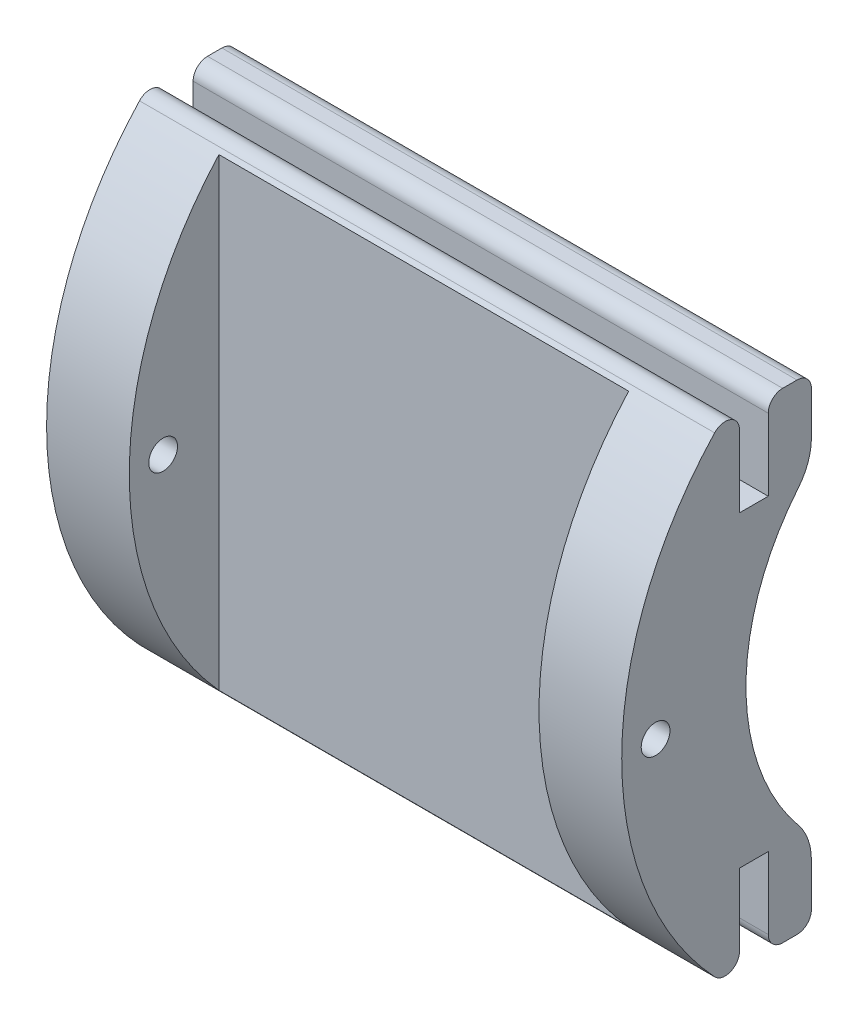
ISO-10303-21;
HEADER;
FILE_DESCRIPTION(('STEP AP214'),'2;1');
FILE_NAME('part.step','',(''),(''),'','','');
FILE_SCHEMA(('AUTOMOTIVE_DESIGN { 1 0 10303 214 1 1 1 1 }'));
ENDSEC;
DATA;
#1=APPLICATION_CONTEXT('core data for automotive mechanical design processes');
#2=APPLICATION_PROTOCOL_DEFINITION('international standard','automotive_design',2000,#1);
#3=PRODUCT_CONTEXT('',#1,'mechanical');
#4=PRODUCT('Part','Part','',(#3));
#5=PRODUCT_RELATED_PRODUCT_CATEGORY('part','',(#4));
#6=PRODUCT_DEFINITION_FORMATION('','',#4);
#7=PRODUCT_DEFINITION_CONTEXT('part definition',#1,'design');
#8=PRODUCT_DEFINITION('design','',#6,#7);
#9=PRODUCT_DEFINITION_SHAPE('','',#8);
#10=(LENGTH_UNIT() NAMED_UNIT(*) SI_UNIT(.MILLI.,.METRE.));
#11=(NAMED_UNIT(*) PLANE_ANGLE_UNIT() SI_UNIT($,.RADIAN.));
#12=(NAMED_UNIT(*) SI_UNIT($,.STERADIAN.) SOLID_ANGLE_UNIT());
#13=UNCERTAINTY_MEASURE_WITH_UNIT(LENGTH_MEASURE(1.E-05),#10,'distance_accuracy_value','');
#14=(GEOMETRIC_REPRESENTATION_CONTEXT(3) GLOBAL_UNCERTAINTY_ASSIGNED_CONTEXT((#13)) GLOBAL_UNIT_ASSIGNED_CONTEXT((#10,
#11,#12)) REPRESENTATION_CONTEXT('',''));
#15=CARTESIAN_POINT('',(0.,0.,0.));
#16=DIRECTION('',(0.,0.,1.));
#17=DIRECTION('',(1.,0.,0.));
#18=AXIS2_PLACEMENT_3D('',#15,#16,#17);
#19=CARTESIAN_POINT('',(200.,0.,-76.7889553842882));
#20=DIRECTION('',(-1.,0.,0.));
#21=DIRECTION('',(0.,0.,1.));
#22=AXIS2_PLACEMENT_3D('',#19,#20,#21);
#23=CYLINDRICAL_SURFACE('',#22,120.);
#24=CARTESIAN_POINT('',(0.,0.,-76.7889553842882));
#25=DIRECTION('',(1.,0.,0.));
#26=DIRECTION('',(0.,0.,1.));
#27=AXIS2_PLACEMENT_3D('',#24,#25,#26);
#28=CIRCLE('',#27,120.);
#29=CARTESIAN_POINT('',(0.,81.9130434782609,10.9051339725695));
#30=VERTEX_POINT('',#29);
#31=CARTESIAN_POINT('',(0.,-81.9130434782609,10.9051339725695));
#32=VERTEX_POINT('',#31);
#33=EDGE_CURVE('E215',#30,#32,#28,.T.);
#34=ORIENTED_EDGE('',*,*,#33,.T.);
#35=DIRECTION('',(-1.,0.,0.));
#36=VECTOR('',#35,1.);
#37=CARTESIAN_POINT('',(200.,-81.9130434782609,10.9051339725695));
#38=LINE('',#37,#36);
#39=CARTESIAN_POINT('',(200.,-81.9130434782609,10.9051339725695));
#40=VERTEX_POINT('',#39);
#41=EDGE_CURVE('E212',#40,#32,#38,.T.);
#42=ORIENTED_EDGE('',*,*,#41,.F.);
#43=CARTESIAN_POINT('',(200.,0.,-76.7889553842882));
#44=DIRECTION('',(1.,0.,0.));
#45=DIRECTION('',(0.,0.,1.));
#46=AXIS2_PLACEMENT_3D('',#43,#44,#45);
#47=CIRCLE('',#46,120.);
#48=CARTESIAN_POINT('',(200.,81.9130434782609,10.9051339725695));
#49=VERTEX_POINT('',#48);
#50=EDGE_CURVE('E198',#49,#40,#47,.T.);
#51=ORIENTED_EDGE('',*,*,#50,.F.);
#52=DIRECTION('',(-1.,0.,0.));
#53=VECTOR('',#52,1.);
#54=CARTESIAN_POINT('',(200.,81.9130434782609,10.9051339725695));
#55=LINE('',#54,#53);
#56=EDGE_CURVE('E218',#49,#30,#55,.T.);
#57=ORIENTED_EDGE('',*,*,#56,.T.);
#58=EDGE_LOOP('',(#34,#42,#51,#57));
#59=FACE_BOUND('',#58,.T.);
#60=CARTESIAN_POINT('',(171.247194640817,0.,-76.7889553842882));
#61=DIRECTION('',(-1.,0.,0.));
#62=DIRECTION('',(0.,0.,1.));
#63=AXIS2_PLACEMENT_3D('',#60,#61,#62);
#64=CIRCLE('',#63,120.);
#65=CARTESIAN_POINT('',(171.247194640817,-80.6700757672064,12.0498811440746));
#66=VERTEX_POINT('',#65);
#67=CARTESIAN_POINT('',(171.247194640817,80.6700757672065,12.0498811440746));
#68=VERTEX_POINT('',#67);
#69=EDGE_CURVE('E334',#66,#68,#64,.T.);
#70=ORIENTED_EDGE('',*,*,#69,.F.);
#71=DIRECTION('',(-1.,0.,0.));
#72=VECTOR('',#71,1.);
#73=CARTESIAN_POINT('',(200.,-80.6700757672064,12.0498811440746));
#74=LINE('',#73,#72);
#75=CARTESIAN_POINT('',(28.7528053591719,-80.6700757672064,12.0498811440746));
#76=VERTEX_POINT('',#75);
#77=EDGE_CURVE('E53',#76,#66,#74,.F.);
#78=ORIENTED_EDGE('',*,*,#77,.F.);
#79=CARTESIAN_POINT('',(28.7528053591719,0.,-76.7889553842882));
#80=DIRECTION('',(-1.,0.,0.));
#81=DIRECTION('',(0.,0.,1.));
#82=AXIS2_PLACEMENT_3D('',#79,#80,#81);
#83=CIRCLE('',#82,120.);
#84=CARTESIAN_POINT('',(28.7528053591719,80.6700757672065,12.0498811440746));
#85=VERTEX_POINT('',#84);
#86=EDGE_CURVE('E330',#76,#85,#83,.T.);
#87=ORIENTED_EDGE('',*,*,#86,.T.);
#88=DIRECTION('',(-1.,0.,0.));
#89=VECTOR('',#88,1.);
#90=CARTESIAN_POINT('',(200.,80.6700757672065,12.0498811440746));
#91=LINE('',#90,#89);
#92=EDGE_CURVE('E11',#68,#85,#91,.T.);
#93=ORIENTED_EDGE('',*,*,#92,.F.);
#94=EDGE_LOOP('',(#70,#78,#87,#93));
#95=FACE_BOUND('',#94,.T.);
#96=ADVANCED_FACE('F45',(#59,#95),#23,.T.);
#97=CARTESIAN_POINT('',(200.,0.,31.4379676848695));
#98=DIRECTION('',(-1.,0.,0.));
#99=DIRECTION('',(0.,0.,1.));
#100=AXIS2_PLACEMENT_3D('',#97,#98,#99);
#101=CYLINDRICAL_SURFACE('',#100,5.);
#102=CARTESIAN_POINT('',(200.,0.,31.4379676848695));
#103=DIRECTION('',(1.,0.,0.));
#104=DIRECTION('',(0.,0.,-1.));
#105=AXIS2_PLACEMENT_3D('',#102,#103,#104);
#106=CIRCLE('',#105,5.);
#107=CARTESIAN_POINT('',(200.,0.,26.4379676848695));
#108=VERTEX_POINT('',#107);
#109=EDGE_CURVE('E231',#108,#108,#106,.T.);
#110=ORIENTED_EDGE('',*,*,#109,.T.);
#111=EDGE_LOOP('',(#110));
#112=FACE_BOUND('',#111,.T.);
#113=CARTESIAN_POINT('',(171.247194640817,0.,31.4379676848695));
#114=DIRECTION('',(-1.,0.,0.));
#115=DIRECTION('',(0.,0.,1.));
#116=AXIS2_PLACEMENT_3D('',#113,#114,#115);
#117=CIRCLE('',#116,5.);
#118=CARTESIAN_POINT('',(171.247194640817,0.,36.4379676848695));
#119=VERTEX_POINT('',#118);
#120=EDGE_CURVE('E332',#119,#119,#117,.T.);
#121=ORIENTED_EDGE('',*,*,#120,.T.);
#122=EDGE_LOOP('',(#121));
#123=FACE_BOUND('',#122,.T.);
#124=ADVANCED_FACE('F479',(#112,#123),#101,.F.);
#125=CARTESIAN_POINT('',(200.,-78.5,7.25121358270043));
#126=DIRECTION('',(-1.,0.,0.));
#127=DIRECTION('',(0.,0.,1.));
#128=AXIS2_PLACEMENT_3D('',#125,#126,#127);
#129=PLANE('',#128);
#130=DIRECTION('',(0.,0.,-1.));
#131=VECTOR('',#130,1.);
#132=CARTESIAN_POINT('',(200.,-53.5,-7.74878641729957));
#133=LINE('',#132,#131);
#134=CARTESIAN_POINT('',(200.,-53.5,2.25121358270043));
#135=VERTEX_POINT('',#134);
#136=CARTESIAN_POINT('',(200.,-53.5,-7.74878641729957));
#137=VERTEX_POINT('',#136);
#138=EDGE_CURVE('E272',#135,#137,#133,.T.);
#139=ORIENTED_EDGE('',*,*,#138,.T.);
#140=DIRECTION('',(0.,-1.,0.));
#141=VECTOR('',#140,1.);
#142=CARTESIAN_POINT('',(200.,-78.5,-7.74878641729958));
#143=LINE('',#142,#141);
#144=CARTESIAN_POINT('',(200.,-78.5,-7.74878641729958));
#145=VERTEX_POINT('',#144);
#146=EDGE_CURVE('E147',#137,#145,#143,.T.);
#147=ORIENTED_EDGE('',*,*,#146,.T.);
#148=CARTESIAN_POINT('',(200.,-78.5,-12.7487864172996));
#149=DIRECTION('',(1.,0.,0.));
#150=DIRECTION('',(0.,0.,1.));
#151=AXIS2_PLACEMENT_3D('',#148,#149,#150);
#152=CIRCLE('',#151,4.99999999999999);
#153=CARTESIAN_POINT('',(200.,-83.5,-12.7487864172996));
#154=VERTEX_POINT('',#153);
#155=EDGE_CURVE('E361',#145,#154,#152,.T.);
#156=ORIENTED_EDGE('',*,*,#155,.T.);
#157=DIRECTION('',(0.,0.,-1.));
#158=VECTOR('',#157,1.);
#159=CARTESIAN_POINT('',(200.,-83.5,-17.7487864172996));
#160=LINE('',#159,#158);
#161=CARTESIAN_POINT('',(200.,-83.5,-17.7487864172996));
#162=VERTEX_POINT('',#161);
#163=EDGE_CURVE('E363',#154,#162,#160,.T.);
#164=ORIENTED_EDGE('',*,*,#163,.T.);
#165=CARTESIAN_POINT('',(200.,-78.5,-17.7487864172996));
#166=DIRECTION('',(1.,0.,0.));
#167=DIRECTION('',(0.,0.,1.));
#168=AXIS2_PLACEMENT_3D('',#165,#166,#167);
#169=CIRCLE('',#168,5.);
#170=CARTESIAN_POINT('',(200.,-78.5,-22.7487864172996));
#171=VERTEX_POINT('',#170);
#172=EDGE_CURVE('E365',#162,#171,#169,.T.);
#173=ORIENTED_EDGE('',*,*,#172,.T.);
#174=DIRECTION('',(0.,1.,0.));
#175=VECTOR('',#174,1.);
#176=CARTESIAN_POINT('',(200.,-63.5,-22.7487864172996));
#177=LINE('',#176,#175);
#178=CARTESIAN_POINT('',(200.,-63.5,-22.7487864172996));
#179=VERTEX_POINT('',#178);
#180=EDGE_CURVE('E367',#171,#179,#177,.T.);
#181=ORIENTED_EDGE('',*,*,#180,.T.);
#182=CARTESIAN_POINT('',(200.,-63.5,-2.74878641729957));
#183=DIRECTION('',(1.,0.,0.));
#184=DIRECTION('',(0.,0.,1.));
#185=AXIS2_PLACEMENT_3D('',#182,#183,#184);
#186=CIRCLE('',#185,20.);
#187=CARTESIAN_POINT('',(200.,-50.8,-18.1990291338397));
#188=VERTEX_POINT('',#187);
#189=EDGE_CURVE('E369',#179,#188,#186,.T.);
#190=ORIENTED_EDGE('',*,*,#189,.T.);
#191=CARTESIAN_POINT('',(200.,0.,-80.));
#192=DIRECTION('',(-1.,0.,0.));
#193=DIRECTION('',(0.,0.,1.));
#194=AXIS2_PLACEMENT_3D('',#191,#192,#193);
#195=CIRCLE('',#194,80.);
#196=CARTESIAN_POINT('',(200.,50.8,-18.1990291338397));
#197=VERTEX_POINT('',#196);
#198=EDGE_CURVE('E371',#188,#197,#195,.T.);
#199=ORIENTED_EDGE('',*,*,#198,.T.);
#200=CARTESIAN_POINT('',(200.,63.5,-2.74878641729955));
#201=DIRECTION('',(1.,0.,0.));
#202=DIRECTION('',(0.,0.,-1.));
#203=AXIS2_PLACEMENT_3D('',#200,#201,#202);
#204=CIRCLE('',#203,20.);
#205=CARTESIAN_POINT('',(200.,63.5,-22.7487864172996));
#206=VERTEX_POINT('',#205);
#207=EDGE_CURVE('E373',#197,#206,#204,.T.);
#208=ORIENTED_EDGE('',*,*,#207,.T.);
#209=DIRECTION('',(0.,1.,0.));
#210=VECTOR('',#209,1.);
#211=CARTESIAN_POINT('',(200.,63.5,-22.7487864172995));
#212=LINE('',#211,#210);
#213=CARTESIAN_POINT('',(200.,78.5,-22.7487864172995));
#214=VERTEX_POINT('',#213);
#215=EDGE_CURVE('E375',#206,#214,#212,.T.);
#216=ORIENTED_EDGE('',*,*,#215,.T.);
#217=CARTESIAN_POINT('',(200.,78.5,-17.7487864172996));
#218=DIRECTION('',(1.,0.,0.));
#219=DIRECTION('',(0.,0.,-1.));
#220=AXIS2_PLACEMENT_3D('',#217,#218,#219);
#221=CIRCLE('',#220,5.);
#222=CARTESIAN_POINT('',(200.,83.5,-17.7487864172996));
#223=VERTEX_POINT('',#222);
#224=EDGE_CURVE('E377',#214,#223,#221,.T.);
#225=ORIENTED_EDGE('',*,*,#224,.T.);
#226=DIRECTION('',(0.,0.,1.));
#227=VECTOR('',#226,1.);
#228=CARTESIAN_POINT('',(200.,83.5,-17.7487864172996));
#229=LINE('',#228,#227);
#230=CARTESIAN_POINT('',(200.,83.5,-12.7487864172996));
#231=VERTEX_POINT('',#230);
#232=EDGE_CURVE('E379',#223,#231,#229,.T.);
#233=ORIENTED_EDGE('',*,*,#232,.T.);
#234=CARTESIAN_POINT('',(200.,78.5,-12.7487864172996));
#235=DIRECTION('',(1.,0.,0.));
#236=DIRECTION('',(0.,0.,-1.));
#237=AXIS2_PLACEMENT_3D('',#234,#235,#236);
#238=CIRCLE('',#237,4.99999999999999);
#239=CARTESIAN_POINT('',(200.,78.5,-7.74878641729956));
#240=VERTEX_POINT('',#239);
#241=EDGE_CURVE('E381',#231,#240,#238,.T.);
#242=ORIENTED_EDGE('',*,*,#241,.T.);
#243=DIRECTION('',(0.,-1.,0.));
#244=VECTOR('',#243,1.);
#245=CARTESIAN_POINT('',(200.,78.5,-7.74878641729955));
#246=LINE('',#245,#244);
#247=CARTESIAN_POINT('',(200.,53.5,-7.74878641729955));
#248=VERTEX_POINT('',#247);
#249=EDGE_CURVE('E383',#240,#248,#246,.T.);
#250=ORIENTED_EDGE('',*,*,#249,.T.);
#251=DIRECTION('',(0.,0.,1.));
#252=VECTOR('',#251,1.);
#253=CARTESIAN_POINT('',(200.,53.5,-7.74878641729955));
#254=LINE('',#253,#252);
#255=CARTESIAN_POINT('',(200.,53.5,2.25121358270045));
#256=VERTEX_POINT('',#255);
#257=EDGE_CURVE('E385',#248,#256,#254,.T.);
#258=ORIENTED_EDGE('',*,*,#257,.T.);
#259=DIRECTION('',(0.,1.,0.));
#260=VECTOR('',#259,1.);
#261=CARTESIAN_POINT('',(200.,53.5,2.25121358270045));
#262=LINE('',#261,#260);
#263=CARTESIAN_POINT('',(200.,78.5,2.25121358270046));
#264=VERTEX_POINT('',#263);
#265=EDGE_CURVE('E387',#256,#264,#262,.T.);
#266=ORIENTED_EDGE('',*,*,#265,.T.);
#267=CARTESIAN_POINT('',(200.,78.5,7.25121358270046));
#268=DIRECTION('',(1.,0.,0.));
#269=DIRECTION('',(0.,0.,-1.));
#270=AXIS2_PLACEMENT_3D('',#267,#268,#269);
#271=CIRCLE('',#270,4.99999999999999);
#272=EDGE_CURVE('E206',#264,#49,#271,.T.);
#273=ORIENTED_EDGE('',*,*,#272,.T.);
#274=ORIENTED_EDGE('',*,*,#50,.T.);
#275=CARTESIAN_POINT('',(200.,-78.5,7.25121358270043));
#276=DIRECTION('',(1.,0.,0.));
#277=DIRECTION('',(0.,0.,1.));
#278=AXIS2_PLACEMENT_3D('',#275,#276,#277);
#279=CIRCLE('',#278,5.);
#280=CARTESIAN_POINT('',(200.,-78.5,2.25121358270043));
#281=VERTEX_POINT('',#280);
#282=EDGE_CURVE('E203',#40,#281,#279,.T.);
#283=ORIENTED_EDGE('',*,*,#282,.T.);
#284=DIRECTION('',(0.,1.,0.));
#285=VECTOR('',#284,1.);
#286=CARTESIAN_POINT('',(200.,-53.5,2.25121358270043));
#287=LINE('',#286,#285);
#288=EDGE_CURVE('E67',#281,#135,#287,.T.);
#289=ORIENTED_EDGE('',*,*,#288,.T.);
#290=EDGE_LOOP('',(#139,#147,#156,#164,#173,#181,#190,#199,#208,#216,#225,#233,#242,#250,#258,
#266,#273,#274,#283,#289));
#291=FACE_BOUND('',#290,.T.);
#292=ORIENTED_EDGE('',*,*,#109,.F.);
#293=EDGE_LOOP('',(#292));
#294=FACE_BOUND('',#293,.T.);
#295=ADVANCED_FACE('F200',(#291,#294),#129,.F.);
#296=CARTESIAN_POINT('',(0.,-78.5,7.25121358270043));
#297=DIRECTION('',(-1.,0.,0.));
#298=DIRECTION('',(0.,0.,1.));
#299=AXIS2_PLACEMENT_3D('',#296,#297,#298);
#300=PLANE('',#299);
#301=DIRECTION('',(0.,0.,-1.));
#302=VECTOR('',#301,1.);
#303=CARTESIAN_POINT('',(0.,-53.5,-7.74878641729957));
#304=LINE('',#303,#302);
#305=CARTESIAN_POINT('',(0.,-53.5,2.25121358270043));
#306=VERTEX_POINT('',#305);
#307=CARTESIAN_POINT('',(0.,-53.5,-7.74878641729957));
#308=VERTEX_POINT('',#307);
#309=EDGE_CURVE('E227',#306,#308,#304,.T.);
#310=ORIENTED_EDGE('',*,*,#309,.F.);
#311=DIRECTION('',(0.,1.,0.));
#312=VECTOR('',#311,1.);
#313=CARTESIAN_POINT('',(0.,-53.5,2.25121358270043));
#314=LINE('',#313,#312);
#315=CARTESIAN_POINT('',(0.,-78.5,2.25121358270043));
#316=VERTEX_POINT('',#315);
#317=EDGE_CURVE('E138',#316,#306,#314,.T.);
#318=ORIENTED_EDGE('',*,*,#317,.F.);
#319=CARTESIAN_POINT('',(0.,-78.5,7.25121358270043));
#320=DIRECTION('',(1.,0.,0.));
#321=DIRECTION('',(0.,0.,1.));
#322=AXIS2_PLACEMENT_3D('',#319,#320,#321);
#323=CIRCLE('',#322,5.);
#324=EDGE_CURVE('E269',#32,#316,#323,.T.);
#325=ORIENTED_EDGE('',*,*,#324,.F.);
#326=ORIENTED_EDGE('',*,*,#33,.F.);
#327=CARTESIAN_POINT('',(0.,78.5,7.25121358270046));
#328=DIRECTION('',(1.,0.,0.));
#329=DIRECTION('',(0.,0.,-1.));
#330=AXIS2_PLACEMENT_3D('',#327,#328,#329);
#331=CIRCLE('',#330,4.99999999999999);
#332=CARTESIAN_POINT('',(0.,78.5,2.25121358270046));
#333=VERTEX_POINT('',#332);
#334=EDGE_CURVE('E265',#333,#30,#331,.T.);
#335=ORIENTED_EDGE('',*,*,#334,.F.);
#336=DIRECTION('',(0.,1.,0.));
#337=VECTOR('',#336,1.);
#338=CARTESIAN_POINT('',(0.,53.5,2.25121358270045));
#339=LINE('',#338,#337);
#340=CARTESIAN_POINT('',(0.,53.5,2.25121358270045));
#341=VERTEX_POINT('',#340);
#342=EDGE_CURVE('E262',#341,#333,#339,.T.);
#343=ORIENTED_EDGE('',*,*,#342,.F.);
#344=DIRECTION('',(0.,0.,1.));
#345=VECTOR('',#344,1.);
#346=CARTESIAN_POINT('',(0.,53.5,-7.74878641729955));
#347=LINE('',#346,#345);
#348=CARTESIAN_POINT('',(0.,53.5,-7.74878641729955));
#349=VERTEX_POINT('',#348);
#350=EDGE_CURVE('E259',#349,#341,#347,.T.);
#351=ORIENTED_EDGE('',*,*,#350,.F.);
#352=DIRECTION('',(0.,-1.,0.));
#353=VECTOR('',#352,1.);
#354=CARTESIAN_POINT('',(0.,78.5,-7.74878641729955));
#355=LINE('',#354,#353);
#356=CARTESIAN_POINT('',(0.,78.5,-7.74878641729956));
#357=VERTEX_POINT('',#356);
#358=EDGE_CURVE('E256',#357,#349,#355,.T.);
#359=ORIENTED_EDGE('',*,*,#358,.F.);
#360=CARTESIAN_POINT('',(0.,78.5,-12.7487864172996));
#361=DIRECTION('',(1.,0.,0.));
#362=DIRECTION('',(0.,0.,-1.));
#363=AXIS2_PLACEMENT_3D('',#360,#361,#362);
#364=CIRCLE('',#363,4.99999999999999);
#365=CARTESIAN_POINT('',(0.,83.5,-12.7487864172996));
#366=VERTEX_POINT('',#365);
#367=EDGE_CURVE('E254',#366,#357,#364,.T.);
#368=ORIENTED_EDGE('',*,*,#367,.F.);
#369=DIRECTION('',(0.,0.,1.));
#370=VECTOR('',#369,1.);
#371=CARTESIAN_POINT('',(0.,83.5,-17.7487864172996));
#372=LINE('',#371,#370);
#373=CARTESIAN_POINT('',(0.,83.5,-17.7487864172996));
#374=VERTEX_POINT('',#373);
#375=EDGE_CURVE('E252',#374,#366,#372,.T.);
#376=ORIENTED_EDGE('',*,*,#375,.F.);
#377=CARTESIAN_POINT('',(0.,78.5,-17.7487864172996));
#378=DIRECTION('',(1.,0.,0.));
#379=DIRECTION('',(0.,0.,-1.));
#380=AXIS2_PLACEMENT_3D('',#377,#378,#379);
#381=CIRCLE('',#380,5.);
#382=CARTESIAN_POINT('',(0.,78.5,-22.7487864172995));
#383=VERTEX_POINT('',#382);
#384=EDGE_CURVE('E250',#383,#374,#381,.T.);
#385=ORIENTED_EDGE('',*,*,#384,.F.);
#386=DIRECTION('',(0.,1.,0.));
#387=VECTOR('',#386,1.);
#388=CARTESIAN_POINT('',(0.,63.5,-22.7487864172995));
#389=LINE('',#388,#387);
#390=CARTESIAN_POINT('',(0.,63.5,-22.7487864172996));
#391=VERTEX_POINT('',#390);
#392=EDGE_CURVE('E248',#391,#383,#389,.T.);
#393=ORIENTED_EDGE('',*,*,#392,.F.);
#394=CARTESIAN_POINT('',(0.,63.5,-2.74878641729955));
#395=DIRECTION('',(1.,0.,0.));
#396=DIRECTION('',(0.,0.,-1.));
#397=AXIS2_PLACEMENT_3D('',#394,#395,#396);
#398=CIRCLE('',#397,20.);
#399=CARTESIAN_POINT('',(0.,50.8,-18.1990291338397));
#400=VERTEX_POINT('',#399);
#401=EDGE_CURVE('E246',#400,#391,#398,.T.);
#402=ORIENTED_EDGE('',*,*,#401,.F.);
#403=CARTESIAN_POINT('',(0.,0.,-80.));
#404=DIRECTION('',(-1.,0.,0.));
#405=DIRECTION('',(0.,0.,1.));
#406=AXIS2_PLACEMENT_3D('',#403,#404,#405);
#407=CIRCLE('',#406,80.);
#408=CARTESIAN_POINT('',(0.,-50.8,-18.1990291338397));
#409=VERTEX_POINT('',#408);
#410=EDGE_CURVE('E243',#409,#400,#407,.T.);
#411=ORIENTED_EDGE('',*,*,#410,.F.);
#412=CARTESIAN_POINT('',(0.,-63.5,-2.74878641729957));
#413=DIRECTION('',(1.,0.,0.));
#414=DIRECTION('',(0.,0.,1.));
#415=AXIS2_PLACEMENT_3D('',#412,#413,#414);
#416=CIRCLE('',#415,20.);
#417=CARTESIAN_POINT('',(0.,-63.5,-22.7487864172996));
#418=VERTEX_POINT('',#417);
#419=EDGE_CURVE('E241',#418,#409,#416,.T.);
#420=ORIENTED_EDGE('',*,*,#419,.F.);
#421=DIRECTION('',(0.,1.,0.));
#422=VECTOR('',#421,1.);
#423=CARTESIAN_POINT('',(0.,-63.5,-22.7487864172996));
#424=LINE('',#423,#422);
#425=CARTESIAN_POINT('',(0.,-78.5,-22.7487864172996));
#426=VERTEX_POINT('',#425);
#427=EDGE_CURVE('E239',#426,#418,#424,.T.);
#428=ORIENTED_EDGE('',*,*,#427,.F.);
#429=CARTESIAN_POINT('',(0.,-78.5,-17.7487864172996));
#430=DIRECTION('',(1.,0.,0.));
#431=DIRECTION('',(0.,0.,1.));
#432=AXIS2_PLACEMENT_3D('',#429,#430,#431);
#433=CIRCLE('',#432,5.);
#434=CARTESIAN_POINT('',(0.,-83.5,-17.7487864172996));
#435=VERTEX_POINT('',#434);
#436=EDGE_CURVE('E237',#435,#426,#433,.T.);
#437=ORIENTED_EDGE('',*,*,#436,.F.);
#438=DIRECTION('',(0.,0.,-1.));
#439=VECTOR('',#438,1.);
#440=CARTESIAN_POINT('',(0.,-83.5,-17.7487864172996));
#441=LINE('',#440,#439);
#442=CARTESIAN_POINT('',(0.,-83.5,-12.7487864172996));
#443=VERTEX_POINT('',#442);
#444=EDGE_CURVE('E235',#443,#435,#441,.T.);
#445=ORIENTED_EDGE('',*,*,#444,.F.);
#446=CARTESIAN_POINT('',(0.,-78.5,-12.7487864172996));
#447=DIRECTION('',(1.,0.,0.));
#448=DIRECTION('',(0.,0.,1.));
#449=AXIS2_PLACEMENT_3D('',#446,#447,#448);
#450=CIRCLE('',#449,4.99999999999999);
#451=CARTESIAN_POINT('',(0.,-78.5,-7.74878641729958));
#452=VERTEX_POINT('',#451);
#453=EDGE_CURVE('E233',#452,#443,#450,.T.);
#454=ORIENTED_EDGE('',*,*,#453,.F.);
#455=DIRECTION('',(0.,-1.,0.));
#456=VECTOR('',#455,1.);
#457=CARTESIAN_POINT('',(0.,-78.5,-7.74878641729958));
#458=LINE('',#457,#456);
#459=EDGE_CURVE('E230',#308,#452,#458,.T.);
#460=ORIENTED_EDGE('',*,*,#459,.F.);
#461=EDGE_LOOP('',(#310,#318,#325,#326,#335,#343,#351,#359,#368,#376,#385,#393,#402,#411,#420,
#428,#437,#445,#454,#460));
#462=FACE_BOUND('',#461,.T.);
#463=CARTESIAN_POINT('',(0.,0.,31.4379676848695));
#464=DIRECTION('',(1.,0.,0.));
#465=DIRECTION('',(0.,0.,-1.));
#466=AXIS2_PLACEMENT_3D('',#463,#464,#465);
#467=CIRCLE('',#466,5.);
#468=CARTESIAN_POINT('',(0.,0.,26.4379676848695));
#469=VERTEX_POINT('',#468);
#470=EDGE_CURVE('E350',#469,#469,#467,.T.);
#471=ORIENTED_EDGE('',*,*,#470,.T.);
#472=EDGE_LOOP('',(#471));
#473=FACE_BOUND('',#472,.T.);
#474=ADVANCED_FACE('F400',(#462,#473),#300,.T.);
#475=CARTESIAN_POINT('',(200.,-53.5,-7.74878641729957));
#476=DIRECTION('',(0.,1.,0.));
#477=DIRECTION('',(0.,0.,1.));
#478=AXIS2_PLACEMENT_3D('',#475,#476,#477);
#479=PLANE('',#478);
#480=ORIENTED_EDGE('',*,*,#309,.T.);
#481=DIRECTION('',(-1.,0.,0.));
#482=VECTOR('',#481,1.);
#483=CARTESIAN_POINT('',(200.,-53.5,-7.74878641729957));
#484=LINE('',#483,#482);
#485=EDGE_CURVE('E324',#137,#308,#484,.T.);
#486=ORIENTED_EDGE('',*,*,#485,.F.);
#487=ORIENTED_EDGE('',*,*,#138,.F.);
#488=DIRECTION('',(-1.,0.,0.));
#489=VECTOR('',#488,1.);
#490=CARTESIAN_POINT('',(200.,-53.5,2.25121358270043));
#491=LINE('',#490,#489);
#492=EDGE_CURVE('E223',#135,#306,#491,.T.);
#493=ORIENTED_EDGE('',*,*,#492,.T.);
#494=EDGE_LOOP('',(#480,#486,#487,#493));
#495=FACE_BOUND('',#494,.T.);
#496=ADVANCED_FACE('F47',(#495),#479,.F.);
#497=CARTESIAN_POINT('',(200.,-78.5,-7.74878641729958));
#498=DIRECTION('',(0.,0.,-1.));
#499=DIRECTION('',(0.,1.,0.));
#500=AXIS2_PLACEMENT_3D('',#497,#498,#499);
#501=PLANE('',#500);
#502=ORIENTED_EDGE('',*,*,#459,.T.);
#503=DIRECTION('',(-1.,0.,0.));
#504=VECTOR('',#503,1.);
#505=CARTESIAN_POINT('',(200.,-78.5,-7.74878641729958));
#506=LINE('',#505,#504);
#507=EDGE_CURVE('E321',#145,#452,#506,.T.);
#508=ORIENTED_EDGE('',*,*,#507,.F.);
#509=ORIENTED_EDGE('',*,*,#146,.F.);
#510=ORIENTED_EDGE('',*,*,#485,.T.);
#511=EDGE_LOOP('',(#502,#508,#509,#510));
#512=FACE_BOUND('',#511,.T.);
#513=ADVANCED_FACE('F408',(#512),#501,.F.);
#514=CARTESIAN_POINT('',(200.,-78.5,-12.7487864172996));
#515=DIRECTION('',(-1.,0.,0.));
#516=DIRECTION('',(0.,0.,1.));
#517=AXIS2_PLACEMENT_3D('',#514,#515,#516);
#518=CYLINDRICAL_SURFACE('',#517,4.99999999999999);
#519=ORIENTED_EDGE('',*,*,#453,.T.);
#520=DIRECTION('',(-1.,0.,0.));
#521=VECTOR('',#520,1.);
#522=CARTESIAN_POINT('',(200.,-83.5,-12.7487864172996));
#523=LINE('',#522,#521);
#524=EDGE_CURVE('E318',#154,#443,#523,.T.);
#525=ORIENTED_EDGE('',*,*,#524,.F.);
#526=ORIENTED_EDGE('',*,*,#155,.F.);
#527=ORIENTED_EDGE('',*,*,#507,.T.);
#528=EDGE_LOOP('',(#519,#525,#526,#527));
#529=FACE_BOUND('',#528,.T.);
#530=ADVANCED_FACE('F411',(#529),#518,.T.);
#531=CARTESIAN_POINT('',(200.,-83.5,-17.7487864172996));
#532=DIRECTION('',(0.,1.,0.));
#533=DIRECTION('',(0.,0.,1.));
#534=AXIS2_PLACEMENT_3D('',#531,#532,#533);
#535=PLANE('',#534);
#536=ORIENTED_EDGE('',*,*,#444,.T.);
#537=DIRECTION('',(-1.,0.,0.));
#538=VECTOR('',#537,1.);
#539=CARTESIAN_POINT('',(200.,-83.5,-17.7487864172996));
#540=LINE('',#539,#538);
#541=EDGE_CURVE('E315',#162,#435,#540,.T.);
#542=ORIENTED_EDGE('',*,*,#541,.F.);
#543=ORIENTED_EDGE('',*,*,#163,.F.);
#544=ORIENTED_EDGE('',*,*,#524,.T.);
#545=EDGE_LOOP('',(#536,#542,#543,#544));
#546=FACE_BOUND('',#545,.T.);
#547=ADVANCED_FACE('F416',(#546),#535,.F.);
#548=CARTESIAN_POINT('',(200.,-78.5,-17.7487864172996));
#549=DIRECTION('',(-1.,0.,0.));
#550=DIRECTION('',(0.,0.,1.));
#551=AXIS2_PLACEMENT_3D('',#548,#549,#550);
#552=CYLINDRICAL_SURFACE('',#551,5.);
#553=ORIENTED_EDGE('',*,*,#436,.T.);
#554=DIRECTION('',(-1.,0.,0.));
#555=VECTOR('',#554,1.);
#556=CARTESIAN_POINT('',(200.,-78.5,-22.7487864172996));
#557=LINE('',#556,#555);
#558=EDGE_CURVE('E312',#171,#426,#557,.T.);
#559=ORIENTED_EDGE('',*,*,#558,.F.);
#560=ORIENTED_EDGE('',*,*,#172,.F.);
#561=ORIENTED_EDGE('',*,*,#541,.T.);
#562=EDGE_LOOP('',(#553,#559,#560,#561));
#563=FACE_BOUND('',#562,.T.);
#564=ADVANCED_FACE('F422',(#563),#552,.T.);
#565=CARTESIAN_POINT('',(200.,-63.5,-22.7487864172996));
#566=DIRECTION('',(0.,0.,1.));
#567=DIRECTION('',(1.,0.,0.));
#568=AXIS2_PLACEMENT_3D('',#565,#566,#567);
#569=PLANE('',#568);
#570=ORIENTED_EDGE('',*,*,#427,.T.);
#571=DIRECTION('',(-1.,0.,0.));
#572=VECTOR('',#571,1.);
#573=CARTESIAN_POINT('',(200.,-63.5,-22.7487864172996));
#574=LINE('',#573,#572);
#575=EDGE_CURVE('E309',#179,#418,#574,.T.);
#576=ORIENTED_EDGE('',*,*,#575,.F.);
#577=ORIENTED_EDGE('',*,*,#180,.F.);
#578=ORIENTED_EDGE('',*,*,#558,.T.);
#579=EDGE_LOOP('',(#570,#576,#577,#578));
#580=FACE_BOUND('',#579,.T.);
#581=ADVANCED_FACE('F426',(#580),#569,.F.);
#582=CARTESIAN_POINT('',(200.,-63.5,-2.74878641729957));
#583=DIRECTION('',(-1.,0.,0.));
#584=DIRECTION('',(0.,0.,1.));
#585=AXIS2_PLACEMENT_3D('',#582,#583,#584);
#586=CYLINDRICAL_SURFACE('',#585,20.);
#587=ORIENTED_EDGE('',*,*,#419,.T.);
#588=DIRECTION('',(-1.,0.,0.));
#589=VECTOR('',#588,1.);
#590=CARTESIAN_POINT('',(200.,-50.8,-18.1990291338397));
#591=LINE('',#590,#589);
#592=EDGE_CURVE('E306',#188,#409,#591,.T.);
#593=ORIENTED_EDGE('',*,*,#592,.F.);
#594=ORIENTED_EDGE('',*,*,#189,.F.);
#595=ORIENTED_EDGE('',*,*,#575,.T.);
#596=EDGE_LOOP('',(#587,#593,#594,#595));
#597=FACE_BOUND('',#596,.T.);
#598=ADVANCED_FACE('F431',(#597),#586,.T.);
#599=CARTESIAN_POINT('',(200.,0.,-80.));
#600=DIRECTION('',(-1.,0.,0.));
#601=DIRECTION('',(0.,0.,1.));
#602=AXIS2_PLACEMENT_3D('',#599,#600,#601);
#603=CYLINDRICAL_SURFACE('',#602,80.);
#604=ORIENTED_EDGE('',*,*,#410,.T.);
#605=DIRECTION('',(-1.,0.,0.));
#606=VECTOR('',#605,1.);
#607=CARTESIAN_POINT('',(200.,50.8,-18.1990291338397));
#608=LINE('',#607,#606);
#609=EDGE_CURVE('E302',#197,#400,#608,.T.);
#610=ORIENTED_EDGE('',*,*,#609,.F.);
#611=ORIENTED_EDGE('',*,*,#198,.F.);
#612=ORIENTED_EDGE('',*,*,#592,.T.);
#613=EDGE_LOOP('',(#604,#610,#611,#612));
#614=FACE_BOUND('',#613,.T.);
#615=ADVANCED_FACE('F437',(#614),#603,.F.);
#616=CARTESIAN_POINT('',(200.,63.5,-2.74878641729955));
#617=DIRECTION('',(-1.,0.,0.));
#618=DIRECTION('',(0.,0.,1.));
#619=AXIS2_PLACEMENT_3D('',#616,#617,#618);
#620=CYLINDRICAL_SURFACE('',#619,20.);
#621=ORIENTED_EDGE('',*,*,#401,.T.);
#622=DIRECTION('',(-1.,0.,0.));
#623=VECTOR('',#622,1.);
#624=CARTESIAN_POINT('',(200.,63.5,-22.7487864172996));
#625=LINE('',#624,#623);
#626=EDGE_CURVE('E299',#206,#391,#625,.T.);
#627=ORIENTED_EDGE('',*,*,#626,.F.);
#628=ORIENTED_EDGE('',*,*,#207,.F.);
#629=ORIENTED_EDGE('',*,*,#609,.T.);
#630=EDGE_LOOP('',(#621,#627,#628,#629));
#631=FACE_BOUND('',#630,.T.);
#632=ADVANCED_FACE('F441',(#631),#620,.T.);
#633=CARTESIAN_POINT('',(200.,63.5,-22.7487864172995));
#634=DIRECTION('',(0.,0.,1.));
#635=DIRECTION('',(1.,0.,0.));
#636=AXIS2_PLACEMENT_3D('',#633,#634,#635);
#637=PLANE('',#636);
#638=ORIENTED_EDGE('',*,*,#392,.T.);
#639=DIRECTION('',(-1.,0.,0.));
#640=VECTOR('',#639,1.);
#641=CARTESIAN_POINT('',(200.,78.5,-22.7487864172995));
#642=LINE('',#641,#640);
#643=EDGE_CURVE('E296',#214,#383,#642,.T.);
#644=ORIENTED_EDGE('',*,*,#643,.F.);
#645=ORIENTED_EDGE('',*,*,#215,.F.);
#646=ORIENTED_EDGE('',*,*,#626,.T.);
#647=EDGE_LOOP('',(#638,#644,#645,#646));
#648=FACE_BOUND('',#647,.T.);
#649=ADVANCED_FACE('F446',(#648),#637,.F.);
#650=CARTESIAN_POINT('',(200.,78.5,-17.7487864172996));
#651=DIRECTION('',(-1.,0.,0.));
#652=DIRECTION('',(0.,0.,1.));
#653=AXIS2_PLACEMENT_3D('',#650,#651,#652);
#654=CYLINDRICAL_SURFACE('',#653,5.);
#655=ORIENTED_EDGE('',*,*,#384,.T.);
#656=DIRECTION('',(-1.,0.,0.));
#657=VECTOR('',#656,1.);
#658=CARTESIAN_POINT('',(200.,83.5,-17.7487864172996));
#659=LINE('',#658,#657);
#660=EDGE_CURVE('E293',#223,#374,#659,.T.);
#661=ORIENTED_EDGE('',*,*,#660,.F.);
#662=ORIENTED_EDGE('',*,*,#224,.F.);
#663=ORIENTED_EDGE('',*,*,#643,.T.);
#664=EDGE_LOOP('',(#655,#661,#662,#663));
#665=FACE_BOUND('',#664,.T.);
#666=ADVANCED_FACE('F452',(#665),#654,.T.);
#667=CARTESIAN_POINT('',(200.,83.5,-17.7487864172996));
#668=DIRECTION('',(0.,-1.,0.));
#669=DIRECTION('',(0.,0.,-1.));
#670=AXIS2_PLACEMENT_3D('',#667,#668,#669);
#671=PLANE('',#670);
#672=ORIENTED_EDGE('',*,*,#375,.T.);
#673=DIRECTION('',(-1.,0.,0.));
#674=VECTOR('',#673,1.);
#675=CARTESIAN_POINT('',(200.,83.5,-12.7487864172996));
#676=LINE('',#675,#674);
#677=EDGE_CURVE('E290',#231,#366,#676,.T.);
#678=ORIENTED_EDGE('',*,*,#677,.F.);
#679=ORIENTED_EDGE('',*,*,#232,.F.);
#680=ORIENTED_EDGE('',*,*,#660,.T.);
#681=EDGE_LOOP('',(#672,#678,#679,#680));
#682=FACE_BOUND('',#681,.T.);
#683=ADVANCED_FACE('F456',(#682),#671,.F.);
#684=CARTESIAN_POINT('',(200.,78.5,-12.7487864172996));
#685=DIRECTION('',(-1.,0.,0.));
#686=DIRECTION('',(0.,0.,1.));
#687=AXIS2_PLACEMENT_3D('',#684,#685,#686);
#688=CYLINDRICAL_SURFACE('',#687,4.99999999999999);
#689=ORIENTED_EDGE('',*,*,#367,.T.);
#690=DIRECTION('',(-1.,0.,0.));
#691=VECTOR('',#690,1.);
#692=CARTESIAN_POINT('',(200.,78.5,-7.74878641729956));
#693=LINE('',#692,#691);
#694=EDGE_CURVE('E287',#240,#357,#693,.T.);
#695=ORIENTED_EDGE('',*,*,#694,.F.);
#696=ORIENTED_EDGE('',*,*,#241,.F.);
#697=ORIENTED_EDGE('',*,*,#677,.T.);
#698=EDGE_LOOP('',(#689,#695,#696,#697));
#699=FACE_BOUND('',#698,.T.);
#700=ADVANCED_FACE('F461',(#699),#688,.T.);
#701=CARTESIAN_POINT('',(200.,78.5,-7.74878641729955));
#702=DIRECTION('',(0.,0.,-1.));
#703=DIRECTION('',(-1.,0.,0.));
#704=AXIS2_PLACEMENT_3D('',#701,#702,#703);
#705=PLANE('',#704);
#706=ORIENTED_EDGE('',*,*,#358,.T.);
#707=DIRECTION('',(-1.,0.,0.));
#708=VECTOR('',#707,1.);
#709=CARTESIAN_POINT('',(200.,53.5,-7.74878641729955));
#710=LINE('',#709,#708);
#711=EDGE_CURVE('E283',#248,#349,#710,.T.);
#712=ORIENTED_EDGE('',*,*,#711,.F.);
#713=ORIENTED_EDGE('',*,*,#249,.F.);
#714=ORIENTED_EDGE('',*,*,#694,.T.);
#715=EDGE_LOOP('',(#706,#712,#713,#714));
#716=FACE_BOUND('',#715,.T.);
#717=ADVANCED_FACE('F465',(#716),#705,.F.);
#718=CARTESIAN_POINT('',(200.,53.5,-7.74878641729955));
#719=DIRECTION('',(0.,-1.,0.));
#720=DIRECTION('',(0.,0.,-1.));
#721=AXIS2_PLACEMENT_3D('',#718,#719,#720);
#722=PLANE('',#721);
#723=ORIENTED_EDGE('',*,*,#350,.T.);
#724=DIRECTION('',(-1.,0.,0.));
#725=VECTOR('',#724,1.);
#726=CARTESIAN_POINT('',(200.,53.5,2.25121358270045));
#727=LINE('',#726,#725);
#728=EDGE_CURVE('E279',#256,#341,#727,.T.);
#729=ORIENTED_EDGE('',*,*,#728,.F.);
#730=ORIENTED_EDGE('',*,*,#257,.F.);
#731=ORIENTED_EDGE('',*,*,#711,.T.);
#732=EDGE_LOOP('',(#723,#729,#730,#731));
#733=FACE_BOUND('',#732,.T.);
#734=ADVANCED_FACE('F469',(#733),#722,.F.);
#735=CARTESIAN_POINT('',(200.,53.5,2.25121358270045));
#736=DIRECTION('',(0.,0.,1.));
#737=DIRECTION('',(0.,-1.,0.));
#738=AXIS2_PLACEMENT_3D('',#735,#736,#737);
#739=PLANE('',#738);
#740=ORIENTED_EDGE('',*,*,#342,.T.);
#741=DIRECTION('',(-1.,0.,0.));
#742=VECTOR('',#741,1.);
#743=CARTESIAN_POINT('',(200.,78.5,2.25121358270046));
#744=LINE('',#743,#742);
#745=EDGE_CURVE('E276',#264,#333,#744,.T.);
#746=ORIENTED_EDGE('',*,*,#745,.F.);
#747=ORIENTED_EDGE('',*,*,#265,.F.);
#748=ORIENTED_EDGE('',*,*,#728,.T.);
#749=EDGE_LOOP('',(#740,#746,#747,#748));
#750=FACE_BOUND('',#749,.T.);
#751=ADVANCED_FACE('F393',(#750),#739,.F.);
#752=CARTESIAN_POINT('',(200.,78.5,7.25121358270046));
#753=DIRECTION('',(-1.,0.,0.));
#754=DIRECTION('',(0.,0.,1.));
#755=AXIS2_PLACEMENT_3D('',#752,#753,#754);
#756=CYLINDRICAL_SURFACE('',#755,4.99999999999999);
#757=ORIENTED_EDGE('',*,*,#334,.T.);
#758=ORIENTED_EDGE('',*,*,#56,.F.);
#759=ORIENTED_EDGE('',*,*,#272,.F.);
#760=ORIENTED_EDGE('',*,*,#745,.T.);
#761=EDGE_LOOP('',(#757,#758,#759,#760));
#762=FACE_BOUND('',#761,.T.);
#763=ADVANCED_FACE('F397',(#762),#756,.T.);
#764=CARTESIAN_POINT('',(200.,-78.5,7.25121358270043));
#765=DIRECTION('',(-1.,0.,0.));
#766=DIRECTION('',(0.,0.,1.));
#767=AXIS2_PLACEMENT_3D('',#764,#765,#766);
#768=CYLINDRICAL_SURFACE('',#767,5.);
#769=ORIENTED_EDGE('',*,*,#324,.T.);
#770=DIRECTION('',(-1.,0.,0.));
#771=VECTOR('',#770,1.);
#772=CARTESIAN_POINT('',(200.,-78.5,2.25121358270043));
#773=LINE('',#772,#771);
#774=EDGE_CURVE('E219',#281,#316,#773,.T.);
#775=ORIENTED_EDGE('',*,*,#774,.F.);
#776=ORIENTED_EDGE('',*,*,#282,.F.);
#777=ORIENTED_EDGE('',*,*,#41,.T.);
#778=EDGE_LOOP('',(#769,#775,#776,#777));
#779=FACE_BOUND('',#778,.T.);
#780=ADVANCED_FACE('F221',(#779),#768,.T.);
#781=CARTESIAN_POINT('',(200.,-53.5,2.25121358270043));
#782=DIRECTION('',(0.,0.,1.));
#783=DIRECTION('',(1.,0.,0.));
#784=AXIS2_PLACEMENT_3D('',#781,#782,#783);
#785=PLANE('',#784);
#786=ORIENTED_EDGE('',*,*,#317,.T.);
#787=ORIENTED_EDGE('',*,*,#492,.F.);
#788=ORIENTED_EDGE('',*,*,#288,.F.);
#789=ORIENTED_EDGE('',*,*,#774,.T.);
#790=EDGE_LOOP('',(#786,#787,#788,#789));
#791=FACE_BOUND('',#790,.T.);
#792=ADVANCED_FACE('F402',(#791),#785,.F.);
#793=CARTESIAN_POINT('',(28.7528053591719,0.,31.4379676848695));
#794=DIRECTION('',(-1.,0.,0.));
#795=DIRECTION('',(0.,0.,1.));
#796=AXIS2_PLACEMENT_3D('',#793,#794,#795);
#797=CIRCLE('',#796,5.);
#798=CARTESIAN_POINT('',(28.7528053591719,0.,36.4379676848695));
#799=VERTEX_POINT('',#798);
#800=EDGE_CURVE('E326',#799,#799,#797,.T.);
#801=ORIENTED_EDGE('',*,*,#800,.F.);
#802=EDGE_LOOP('',(#801));
#803=FACE_BOUND('',#802,.T.);
#804=ORIENTED_EDGE('',*,*,#470,.F.);
#805=EDGE_LOOP('',(#804));
#806=FACE_BOUND('',#805,.T.);
#807=ADVANCED_FACE('F487',(#803,#806),#101,.F.);
#808=CARTESIAN_POINT('',(28.7528053591719,-83.5,12.0498811440746));
#809=DIRECTION('',(0.,0.,1.));
#810=DIRECTION('',(1.,0.,0.));
#811=AXIS2_PLACEMENT_3D('',#808,#809,#810);
#812=PLANE('',#811);
#813=ORIENTED_EDGE('',*,*,#92,.T.);
#814=DIRECTION('',(0.,1.,0.));
#815=VECTOR('',#814,1.);
#816=CARTESIAN_POINT('',(28.7528053591719,-83.5,12.0498811440746));
#817=LINE('',#816,#815);
#818=EDGE_CURVE('E59',#76,#85,#817,.T.);
#819=ORIENTED_EDGE('',*,*,#818,.F.);
#820=ORIENTED_EDGE('',*,*,#77,.T.);
#821=DIRECTION('',(0.,1.,0.));
#822=VECTOR('',#821,1.);
#823=CARTESIAN_POINT('',(171.247194640817,-83.5,12.0498811440746));
#824=LINE('',#823,#822);
#825=EDGE_CURVE('E331',#66,#68,#824,.T.);
#826=ORIENTED_EDGE('',*,*,#825,.T.);
#827=EDGE_LOOP('',(#813,#819,#820,#826));
#828=FACE_BOUND('',#827,.T.);
#829=ADVANCED_FACE('F341',(#828),#812,.T.);
#830=CARTESIAN_POINT('',(171.247194640817,-83.5,12.0498811440746));
#831=DIRECTION('',(-1.,0.,0.));
#832=DIRECTION('',(0.,0.,1.));
#833=AXIS2_PLACEMENT_3D('',#830,#831,#832);
#834=PLANE('',#833);
#835=ORIENTED_EDGE('',*,*,#120,.F.);
#836=EDGE_LOOP('',(#835));
#837=FACE_BOUND('',#836,.T.);
#838=ORIENTED_EDGE('',*,*,#69,.T.);
#839=ORIENTED_EDGE('',*,*,#825,.F.);
#840=EDGE_LOOP('',(#838,#839));
#841=FACE_BOUND('',#840,.T.);
#842=ADVANCED_FACE('F348',(#837,#841),#834,.T.);
#843=CARTESIAN_POINT('',(28.7528053591719,-83.5,12.0498811440746));
#844=DIRECTION('',(-1.,0.,0.));
#845=DIRECTION('',(0.,0.,1.));
#846=AXIS2_PLACEMENT_3D('',#843,#844,#845);
#847=PLANE('',#846);
#848=ORIENTED_EDGE('',*,*,#800,.T.);
#849=EDGE_LOOP('',(#848));
#850=FACE_BOUND('',#849,.T.);
#851=ORIENTED_EDGE('',*,*,#818,.T.);
#852=ORIENTED_EDGE('',*,*,#86,.F.);
#853=EDGE_LOOP('',(#851,#852));
#854=FACE_BOUND('',#853,.T.);
#855=ADVANCED_FACE('F510',(#850,#854),#847,.F.);
#856=CLOSED_SHELL('',(#96,#124,#295,#474,#496,#513,#530,#547,#564,#581,#598,#615,#632,#649,#666,
#683,#700,#717,#734,#751,#763,#780,#792,#807,#829,#842,#855));
#857=MANIFOLD_SOLID_BREP('B2',#856);
#858=ADVANCED_BREP_SHAPE_REPRESENTATION('',(#18,#857),#14);
#859=SHAPE_DEFINITION_REPRESENTATION(#9,#858);
ENDSEC;
END-ISO-10303-21;
